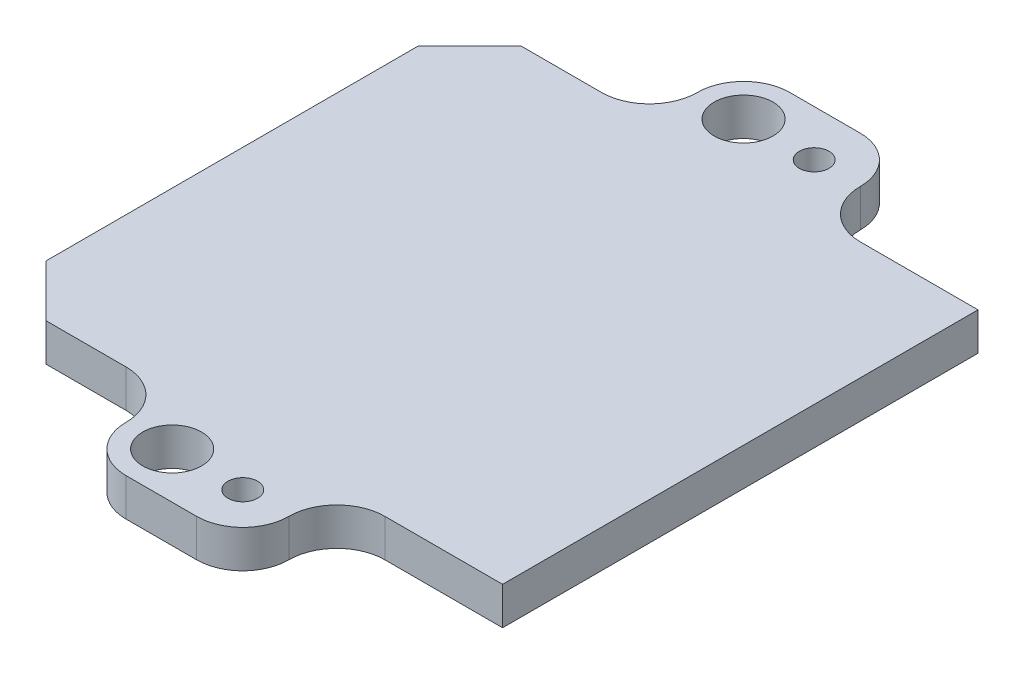
ISO-10303-21;
HEADER;
FILE_DESCRIPTION(('STEP AP214'),'2;1');
FILE_NAME('part.step','',(''),(''),'','','');
FILE_SCHEMA(('AUTOMOTIVE_DESIGN { 1 0 10303 214 1 1 1 1 }'));
ENDSEC;
DATA;
#1=APPLICATION_CONTEXT('core data for automotive mechanical design processes');
#2=APPLICATION_PROTOCOL_DEFINITION('international standard','automotive_design',2000,#1);
#3=PRODUCT_CONTEXT('',#1,'mechanical');
#4=PRODUCT('Part','Part','',(#3));
#5=PRODUCT_RELATED_PRODUCT_CATEGORY('part','',(#4));
#6=PRODUCT_DEFINITION_FORMATION('','',#4);
#7=PRODUCT_DEFINITION_CONTEXT('part definition',#1,'design');
#8=PRODUCT_DEFINITION('design','',#6,#7);
#9=PRODUCT_DEFINITION_SHAPE('','',#8);
#10=(LENGTH_UNIT() NAMED_UNIT(*) SI_UNIT(.MILLI.,.METRE.));
#11=(NAMED_UNIT(*) PLANE_ANGLE_UNIT() SI_UNIT($,.RADIAN.));
#12=(NAMED_UNIT(*) SI_UNIT($,.STERADIAN.) SOLID_ANGLE_UNIT());
#13=UNCERTAINTY_MEASURE_WITH_UNIT(LENGTH_MEASURE(1.E-05),#10,'distance_accuracy_value','');
#14=(GEOMETRIC_REPRESENTATION_CONTEXT(3) GLOBAL_UNCERTAINTY_ASSIGNED_CONTEXT((#13)) GLOBAL_UNIT_ASSIGNED_CONTEXT((#10,
#11,#12)) REPRESENTATION_CONTEXT('',''));
#15=CARTESIAN_POINT('',(0.,0.,0.));
#16=DIRECTION('',(0.,0.,1.));
#17=DIRECTION('',(1.,0.,0.));
#18=AXIS2_PLACEMENT_3D('',#15,#16,#17);
#19=CARTESIAN_POINT('',(4.77519999999999,2.032,-15.4178));
#20=DIRECTION('',(0.,1.,0.));
#21=DIRECTION('',(0.,0.,1.));
#22=AXIS2_PLACEMENT_3D('',#19,#20,#21);
#23=PLANE('',#22);
#24=DIRECTION('',(-1.,0.,0.));
#25=VECTOR('',#24,1.);
#26=CARTESIAN_POINT('',(-10.922,2.032,-12.827));
#27=LINE('',#26,#25);
#28=CARTESIAN_POINT('',(13.716,2.032,-12.827));
#29=VERTEX_POINT('',#28);
#30=CARTESIAN_POINT('',(7.36599999999999,2.032,-12.827));
#31=VERTEX_POINT('',#30);
#32=EDGE_CURVE('E52',#29,#31,#27,.T.);
#33=ORIENTED_EDGE('',*,*,#32,.T.);
#34=CARTESIAN_POINT('',(7.366,2.032,-15.4178));
#35=DIRECTION('',(0.,-1.,0.));
#36=DIRECTION('',(0.,0.,-1.));
#37=AXIS2_PLACEMENT_3D('',#34,#35,#36);
#38=CIRCLE('',#37,2.5908);
#39=CARTESIAN_POINT('',(4.77519999999999,2.032,-15.4178));
#40=VERTEX_POINT('',#39);
#41=EDGE_CURVE('E44',#31,#40,#38,.T.);
#42=ORIENTED_EDGE('',*,*,#41,.T.);
#43=CARTESIAN_POINT('',(2.28599999999999,2.032,-15.4178));
#44=DIRECTION('',(0.,-1.,0.));
#45=DIRECTION('',(0.,0.,-1.));
#46=AXIS2_PLACEMENT_3D('',#43,#44,#45);
#47=CIRCLE('',#46,2.4892);
#48=CARTESIAN_POINT('',(2.28599999999999,2.032,-17.907));
#49=VERTEX_POINT('',#48);
#50=EDGE_CURVE('E279',#40,#49,#47,.F.);
#51=ORIENTED_EDGE('',*,*,#50,.T.);
#52=DIRECTION('',(1.,0.,0.));
#53=VECTOR('',#52,1.);
#54=CARTESIAN_POINT('',(-13.717,2.032,-17.907));
#55=LINE('',#54,#53);
#56=CARTESIAN_POINT('',(-1.52400000000001,2.032,-17.907));
#57=VERTEX_POINT('',#56);
#58=EDGE_CURVE('E282',#57,#49,#55,.T.);
#59=ORIENTED_EDGE('',*,*,#58,.F.);
#60=CARTESIAN_POINT('',(-1.52400000000001,2.032,-15.4178));
#61=DIRECTION('',(0.,-1.,0.));
#62=DIRECTION('',(0.,0.,-1.));
#63=AXIS2_PLACEMENT_3D('',#60,#61,#62);
#64=CIRCLE('',#63,2.4892);
#65=CARTESIAN_POINT('',(-4.01320000000001,2.032,-15.4178));
#66=VERTEX_POINT('',#65);
#67=EDGE_CURVE('E58',#57,#66,#64,.F.);
#68=ORIENTED_EDGE('',*,*,#67,.T.);
#69=CARTESIAN_POINT('',(-6.60400000000001,2.032,-15.4178));
#70=DIRECTION('',(0.,-1.,0.));
#71=DIRECTION('',(0.,0.,-1.));
#72=AXIS2_PLACEMENT_3D('',#69,#70,#71);
#73=CIRCLE('',#72,2.5908);
#74=CARTESIAN_POINT('',(-6.60400000000001,2.032,-12.827));
#75=VERTEX_POINT('',#74);
#76=EDGE_CURVE('E11',#66,#75,#73,.T.);
#77=ORIENTED_EDGE('',*,*,#76,.T.);
#78=CARTESIAN_POINT('',(-10.922,2.032,-12.827));
#79=VERTEX_POINT('',#78);
#80=EDGE_CURVE('E293',#75,#79,#27,.T.);
#81=ORIENTED_EDGE('',*,*,#80,.T.);
#82=DIRECTION('',(-0.707106781186551,0.,0.707106781186544));
#83=VECTOR('',#82,1.);
#84=CARTESIAN_POINT('',(-10.922,2.032,-12.827));
#85=LINE('',#84,#83);
#86=CARTESIAN_POINT('',(-13.716,2.032,-10.033));
#87=VERTEX_POINT('',#86);
#88=EDGE_CURVE('E296',#79,#87,#85,.T.);
#89=ORIENTED_EDGE('',*,*,#88,.T.);
#90=DIRECTION('',(0.,0.,1.));
#91=VECTOR('',#90,1.);
#92=CARTESIAN_POINT('',(-13.716,2.032,-10.033));
#93=LINE('',#92,#91);
#94=CARTESIAN_POINT('',(-13.716,2.032,10.033));
#95=VERTEX_POINT('',#94);
#96=EDGE_CURVE('E187',#87,#95,#93,.T.);
#97=ORIENTED_EDGE('',*,*,#96,.T.);
#98=DIRECTION('',(0.707106781186546,0.,0.707106781186549));
#99=VECTOR('',#98,1.);
#100=CARTESIAN_POINT('',(-13.716,2.032,10.033));
#101=LINE('',#100,#99);
#102=CARTESIAN_POINT('',(-10.922,2.032,12.827));
#103=VERTEX_POINT('',#102);
#104=EDGE_CURVE('E184',#95,#103,#101,.T.);
#105=ORIENTED_EDGE('',*,*,#104,.T.);
#106=DIRECTION('',(1.,0.,0.));
#107=VECTOR('',#106,1.);
#108=CARTESIAN_POINT('',(-10.922,2.032,12.827));
#109=LINE('',#108,#107);
#110=CARTESIAN_POINT('',(-6.60400000000001,2.032,12.827));
#111=VERTEX_POINT('',#110);
#112=EDGE_CURVE('E165',#103,#111,#109,.T.);
#113=ORIENTED_EDGE('',*,*,#112,.T.);
#114=CARTESIAN_POINT('',(-6.60400000000001,2.032,15.4178));
#115=DIRECTION('',(0.,-1.,0.));
#116=DIRECTION('',(0.,0.,-1.));
#117=AXIS2_PLACEMENT_3D('',#114,#115,#116);
#118=CIRCLE('',#117,2.5908);
#119=CARTESIAN_POINT('',(-4.01320000000001,2.032,15.4178));
#120=VERTEX_POINT('',#119);
#121=EDGE_CURVE('E174',#111,#120,#118,.T.);
#122=ORIENTED_EDGE('',*,*,#121,.T.);
#123=CARTESIAN_POINT('',(-1.52400000000001,2.032,15.4178));
#124=DIRECTION('',(0.,-1.,0.));
#125=DIRECTION('',(0.,0.,-1.));
#126=AXIS2_PLACEMENT_3D('',#123,#124,#125);
#127=CIRCLE('',#126,2.4892);
#128=CARTESIAN_POINT('',(-1.52400000000001,2.032,17.907));
#129=VERTEX_POINT('',#128);
#130=EDGE_CURVE('E177',#120,#129,#127,.F.);
#131=ORIENTED_EDGE('',*,*,#130,.T.);
#132=DIRECTION('',(1.,0.,0.));
#133=VECTOR('',#132,1.);
#134=CARTESIAN_POINT('',(-13.717,2.032,17.907));
#135=LINE('',#134,#133);
#136=CARTESIAN_POINT('',(2.28599999999999,2.032,17.907));
#137=VERTEX_POINT('',#136);
#138=EDGE_CURVE('E178',#129,#137,#135,.T.);
#139=ORIENTED_EDGE('',*,*,#138,.T.);
#140=CARTESIAN_POINT('',(2.28599999999999,2.032,15.4178));
#141=DIRECTION('',(0.,-1.,0.));
#142=DIRECTION('',(0.,0.,-1.));
#143=AXIS2_PLACEMENT_3D('',#140,#141,#142);
#144=CIRCLE('',#143,2.4892);
#145=CARTESIAN_POINT('',(4.77519999999999,2.032,15.4178));
#146=VERTEX_POINT('',#145);
#147=EDGE_CURVE('E268',#137,#146,#144,.F.);
#148=ORIENTED_EDGE('',*,*,#147,.T.);
#149=CARTESIAN_POINT('',(7.36599999999999,2.032,15.4178));
#150=DIRECTION('',(0.,-1.,0.));
#151=DIRECTION('',(0.,0.,-1.));
#152=AXIS2_PLACEMENT_3D('',#149,#150,#151);
#153=CIRCLE('',#152,2.5908);
#154=CARTESIAN_POINT('',(7.36599999999999,2.032,12.827));
#155=VERTEX_POINT('',#154);
#156=EDGE_CURVE('E270',#146,#155,#153,.T.);
#157=ORIENTED_EDGE('',*,*,#156,.T.);
#158=CARTESIAN_POINT('',(13.716,2.032,12.827));
#159=VERTEX_POINT('',#158);
#160=EDGE_CURVE('E185',#155,#159,#109,.T.);
#161=ORIENTED_EDGE('',*,*,#160,.T.);
#162=DIRECTION('',(0.,0.,-1.));
#163=VECTOR('',#162,1.);
#164=CARTESIAN_POINT('',(13.716,2.032,-12.827));
#165=LINE('',#164,#163);
#166=EDGE_CURVE('E195',#159,#29,#165,.T.);
#167=ORIENTED_EDGE('',*,*,#166,.T.);
#168=EDGE_LOOP('',(#33,#42,#51,#59,#68,#77,#81,#89,#97,#105,#113,#122,#131,#139,#148,#157,#161,#167));
#169=FACE_BOUND('',#168,.T.);
#170=CARTESIAN_POINT('',(-1.52400000000001,2.032,-15.4178));
#171=DIRECTION('',(0.,-1.,0.));
#172=DIRECTION('',(0.,0.,-1.));
#173=AXIS2_PLACEMENT_3D('',#170,#171,#172);
#174=CIRCLE('',#173,1.5875);
#175=CARTESIAN_POINT('',(-1.52400000000001,2.032,-17.0053));
#176=VERTEX_POINT('',#175);
#177=EDGE_CURVE('E283',#176,#176,#174,.F.);
#178=ORIENTED_EDGE('',*,*,#177,.F.);
#179=EDGE_LOOP('',(#178));
#180=FACE_BOUND('',#179,.T.);
#181=CARTESIAN_POINT('',(2.28599999999999,2.032,-15.4178));
#182=DIRECTION('',(0.,-1.,0.));
#183=DIRECTION('',(0.,0.,-1.));
#184=AXIS2_PLACEMENT_3D('',#181,#182,#183);
#185=CIRCLE('',#184,0.8001);
#186=CARTESIAN_POINT('',(2.28599999999999,2.032,-16.2179));
#187=VERTEX_POINT('',#186);
#188=EDGE_CURVE('E286',#187,#187,#185,.F.);
#189=ORIENTED_EDGE('',*,*,#188,.F.);
#190=EDGE_LOOP('',(#189));
#191=FACE_BOUND('',#190,.T.);
#192=CARTESIAN_POINT('',(-1.52400000000001,2.032,15.4178));
#193=DIRECTION('',(0.,-1.,0.));
#194=DIRECTION('',(0.,0.,-1.));
#195=AXIS2_PLACEMENT_3D('',#192,#193,#194);
#196=CIRCLE('',#195,1.5875);
#197=CARTESIAN_POINT('',(-1.52400000000001,2.032,13.8303));
#198=VERTEX_POINT('',#197);
#199=EDGE_CURVE('E273',#198,#198,#196,.F.);
#200=ORIENTED_EDGE('',*,*,#199,.F.);
#201=EDGE_LOOP('',(#200));
#202=FACE_BOUND('',#201,.T.);
#203=CARTESIAN_POINT('',(2.28599999999999,2.032,15.4178));
#204=DIRECTION('',(0.,-1.,0.));
#205=DIRECTION('',(0.,0.,-1.));
#206=AXIS2_PLACEMENT_3D('',#203,#204,#205);
#207=CIRCLE('',#206,0.800099999999997);
#208=CARTESIAN_POINT('',(2.28599999999999,2.032,14.6177));
#209=VERTEX_POINT('',#208);
#210=EDGE_CURVE('E276',#209,#209,#207,.F.);
#211=ORIENTED_EDGE('',*,*,#210,.F.);
#212=EDGE_LOOP('',(#211));
#213=FACE_BOUND('',#212,.T.);
#214=ADVANCED_FACE('F35',(#169,#180,#191,#202,#213),#23,.T.);
#215=CARTESIAN_POINT('',(-10.922,8.89,-12.827));
#216=DIRECTION('',(0.707106781186544,0.,0.707106781186551));
#217=DIRECTION('',(0.707106781186551,0.,-0.707106781186544));
#218=AXIS2_PLACEMENT_3D('',#215,#216,#217);
#219=PLANE('',#218);
#220=ORIENTED_EDGE('',*,*,#88,.F.);
#221=DIRECTION('',(0.,-1.,0.));
#222=VECTOR('',#221,1.);
#223=CARTESIAN_POINT('',(-10.922,8.89,-12.827));
#224=LINE('',#223,#222);
#225=CARTESIAN_POINT('',(-10.922,0.,-12.827));
#226=VERTEX_POINT('',#225);
#227=EDGE_CURVE('E198',#79,#226,#224,.T.);
#228=ORIENTED_EDGE('',*,*,#227,.T.);
#229=DIRECTION('',(-0.707106781186551,0.,0.707106781186544));
#230=VECTOR('',#229,1.);
#231=CARTESIAN_POINT('',(-10.922,0.,-12.827));
#232=LINE('',#231,#230);
#233=CARTESIAN_POINT('',(-13.716,0.,-10.033));
#234=VERTEX_POINT('',#233);
#235=EDGE_CURVE('E224',#226,#234,#232,.T.);
#236=ORIENTED_EDGE('',*,*,#235,.T.);
#237=DIRECTION('',(0.,-1.,0.));
#238=VECTOR('',#237,1.);
#239=CARTESIAN_POINT('',(-13.716,8.89,-10.033));
#240=LINE('',#239,#238);
#241=EDGE_CURVE('E200',#87,#234,#240,.T.);
#242=ORIENTED_EDGE('',*,*,#241,.F.);
#243=EDGE_LOOP('',(#220,#228,#236,#242));
#244=FACE_BOUND('',#243,.T.);
#245=ADVANCED_FACE('F306',(#244),#219,.F.);
#246=CARTESIAN_POINT('',(-13.716,8.89,-10.033));
#247=DIRECTION('',(1.,0.,0.));
#248=DIRECTION('',(0.,0.,-1.));
#249=AXIS2_PLACEMENT_3D('',#246,#247,#248);
#250=PLANE('',#249);
#251=ORIENTED_EDGE('',*,*,#96,.F.);
#252=ORIENTED_EDGE('',*,*,#241,.T.);
#253=DIRECTION('',(0.,0.,1.));
#254=VECTOR('',#253,1.);
#255=CARTESIAN_POINT('',(-13.716,0.,-10.033));
#256=LINE('',#255,#254);
#257=CARTESIAN_POINT('',(-13.716,0.,10.033));
#258=VERTEX_POINT('',#257);
#259=EDGE_CURVE('E211',#234,#258,#256,.T.);
#260=ORIENTED_EDGE('',*,*,#259,.T.);
#261=DIRECTION('',(0.,-1.,0.));
#262=VECTOR('',#261,1.);
#263=CARTESIAN_POINT('',(-13.716,8.89,10.033));
#264=LINE('',#263,#262);
#265=EDGE_CURVE('E202',#95,#258,#264,.T.);
#266=ORIENTED_EDGE('',*,*,#265,.F.);
#267=EDGE_LOOP('',(#251,#252,#260,#266));
#268=FACE_BOUND('',#267,.T.);
#269=ADVANCED_FACE('F301',(#268),#250,.F.);
#270=CARTESIAN_POINT('',(-13.716,8.89,10.033));
#271=DIRECTION('',(0.707106781186549,0.,-0.707106781186546));
#272=DIRECTION('',(-0.707106781186546,0.,-0.707106781186549));
#273=AXIS2_PLACEMENT_3D('',#270,#271,#272);
#274=PLANE('',#273);
#275=ORIENTED_EDGE('',*,*,#104,.F.);
#276=ORIENTED_EDGE('',*,*,#265,.T.);
#277=DIRECTION('',(0.707106781186546,0.,0.707106781186549));
#278=VECTOR('',#277,1.);
#279=CARTESIAN_POINT('',(-13.716,0.,10.033));
#280=LINE('',#279,#278);
#281=CARTESIAN_POINT('',(-10.922,0.,12.827));
#282=VERTEX_POINT('',#281);
#283=EDGE_CURVE('E207',#258,#282,#280,.T.);
#284=ORIENTED_EDGE('',*,*,#283,.T.);
#285=DIRECTION('',(0.,-1.,0.));
#286=VECTOR('',#285,1.);
#287=CARTESIAN_POINT('',(-10.922,8.89,12.827));
#288=LINE('',#287,#286);
#289=EDGE_CURVE('E39',#103,#282,#288,.T.);
#290=ORIENTED_EDGE('',*,*,#289,.F.);
#291=EDGE_LOOP('',(#275,#276,#284,#290));
#292=FACE_BOUND('',#291,.T.);
#293=ADVANCED_FACE('F208',(#292),#274,.F.);
#294=CARTESIAN_POINT('',(13.716,8.89,-12.827));
#295=DIRECTION('',(-1.,0.,0.));
#296=DIRECTION('',(0.,0.,1.));
#297=AXIS2_PLACEMENT_3D('',#294,#295,#296);
#298=PLANE('',#297);
#299=ORIENTED_EDGE('',*,*,#166,.F.);
#300=DIRECTION('',(0.,-1.,0.));
#301=VECTOR('',#300,1.);
#302=CARTESIAN_POINT('',(13.716,8.89,12.827));
#303=LINE('',#302,#301);
#304=CARTESIAN_POINT('',(13.716,0.,12.827));
#305=VERTEX_POINT('',#304);
#306=EDGE_CURVE('E192',#159,#305,#303,.T.);
#307=ORIENTED_EDGE('',*,*,#306,.T.);
#308=DIRECTION('',(0.,0.,-1.));
#309=VECTOR('',#308,1.);
#310=CARTESIAN_POINT('',(13.716,0.,-12.827));
#311=LINE('',#310,#309);
#312=CARTESIAN_POINT('',(13.716,0.,-12.827));
#313=VERTEX_POINT('',#312);
#314=EDGE_CURVE('E248',#305,#313,#311,.T.);
#315=ORIENTED_EDGE('',*,*,#314,.T.);
#316=DIRECTION('',(0.,-1.,0.));
#317=VECTOR('',#316,1.);
#318=CARTESIAN_POINT('',(13.716,8.89,-12.827));
#319=LINE('',#318,#317);
#320=EDGE_CURVE('E194',#29,#313,#319,.T.);
#321=ORIENTED_EDGE('',*,*,#320,.F.);
#322=EDGE_LOOP('',(#299,#307,#315,#321));
#323=FACE_BOUND('',#322,.T.);
#324=ADVANCED_FACE('F344',(#323),#298,.F.);
#325=CARTESIAN_POINT('',(-10.922,8.89,12.827));
#326=DIRECTION('',(0.,0.,-1.));
#327=DIRECTION('',(-1.,0.,0.));
#328=AXIS2_PLACEMENT_3D('',#325,#326,#327);
#329=PLANE('',#328);
#330=ORIENTED_EDGE('',*,*,#112,.F.);
#331=ORIENTED_EDGE('',*,*,#289,.T.);
#332=DIRECTION('',(1.,0.,0.));
#333=VECTOR('',#332,1.);
#334=CARTESIAN_POINT('',(-10.922,0.,12.827));
#335=LINE('',#334,#333);
#336=CARTESIAN_POINT('',(-6.60400000000001,0.,12.827));
#337=VERTEX_POINT('',#336);
#338=EDGE_CURVE('E167',#282,#337,#335,.T.);
#339=ORIENTED_EDGE('',*,*,#338,.T.);
#340=DIRECTION('',(0.,-1.,0.));
#341=VECTOR('',#340,1.);
#342=CARTESIAN_POINT('',(-6.60400000000001,8.89,12.827));
#343=LINE('',#342,#341);
#344=EDGE_CURVE('E162',#111,#337,#343,.T.);
#345=ORIENTED_EDGE('',*,*,#344,.F.);
#346=EDGE_LOOP('',(#330,#331,#339,#345));
#347=FACE_BOUND('',#346,.T.);
#348=ADVANCED_FACE('F37',(#347),#329,.F.);
#349=CARTESIAN_POINT('',(-6.60400000000001,8.89,15.4178));
#350=DIRECTION('',(0.,-1.,0.));
#351=DIRECTION('',(0.,0.,-1.));
#352=AXIS2_PLACEMENT_3D('',#349,#350,#351);
#353=CYLINDRICAL_SURFACE('',#352,2.5908);
#354=DIRECTION('',(0.,-1.,0.));
#355=VECTOR('',#354,1.);
#356=CARTESIAN_POINT('',(-4.01320000000001,8.89,15.4178));
#357=LINE('',#356,#355);
#358=CARTESIAN_POINT('',(-4.01320000000001,0.,15.4178));
#359=VERTEX_POINT('',#358);
#360=EDGE_CURVE('E171',#120,#359,#357,.T.);
#361=ORIENTED_EDGE('',*,*,#360,.F.);
#362=ORIENTED_EDGE('',*,*,#121,.F.);
#363=ORIENTED_EDGE('',*,*,#344,.T.);
#364=CARTESIAN_POINT('',(-6.60400000000001,0.,15.4178));
#365=DIRECTION('',(0.,-1.,0.));
#366=DIRECTION('',(0.,0.,1.));
#367=AXIS2_PLACEMENT_3D('',#364,#365,#366);
#368=CIRCLE('',#367,2.5908);
#369=EDGE_CURVE('E217',#337,#359,#368,.T.);
#370=ORIENTED_EDGE('',*,*,#369,.T.);
#371=EDGE_LOOP('',(#361,#362,#363,#370));
#372=FACE_BOUND('',#371,.T.);
#373=ADVANCED_FACE('F175',(#372),#353,.F.);
#374=CARTESIAN_POINT('',(-1.52400000000001,8.89,15.4178));
#375=DIRECTION('',(0.,-1.,0.));
#376=DIRECTION('',(0.,0.,-1.));
#377=AXIS2_PLACEMENT_3D('',#374,#375,#376);
#378=CYLINDRICAL_SURFACE('',#377,2.4892);
#379=DIRECTION('',(0.,-1.,0.));
#380=VECTOR('',#379,1.);
#381=CARTESIAN_POINT('',(-1.52400000000001,8.89,17.907));
#382=LINE('',#381,#380);
#383=CARTESIAN_POINT('',(-1.52400000000001,0.,17.907));
#384=VERTEX_POINT('',#383);
#385=EDGE_CURVE('E372',#129,#384,#382,.T.);
#386=ORIENTED_EDGE('',*,*,#385,.F.);
#387=ORIENTED_EDGE('',*,*,#130,.F.);
#388=ORIENTED_EDGE('',*,*,#360,.T.);
#389=CARTESIAN_POINT('',(-1.52400000000001,0.,15.4178));
#390=DIRECTION('',(0.,1.,0.));
#391=DIRECTION('',(0.,0.,-1.));
#392=AXIS2_PLACEMENT_3D('',#389,#390,#391);
#393=CIRCLE('',#392,2.4892);
#394=EDGE_CURVE('E219',#359,#384,#393,.T.);
#395=ORIENTED_EDGE('',*,*,#394,.T.);
#396=EDGE_LOOP('',(#386,#387,#388,#395));
#397=FACE_BOUND('',#396,.T.);
#398=ADVANCED_FACE('F371',(#397),#378,.T.);
#399=CARTESIAN_POINT('',(-1.52400000000001,8.89,17.907));
#400=DIRECTION('',(0.,0.,-1.));
#401=DIRECTION('',(-1.,0.,0.));
#402=AXIS2_PLACEMENT_3D('',#399,#400,#401);
#403=PLANE('',#402);
#404=DIRECTION('',(0.,-1.,0.));
#405=VECTOR('',#404,1.);
#406=CARTESIAN_POINT('',(2.28599999999999,8.89,17.907));
#407=LINE('',#406,#405);
#408=CARTESIAN_POINT('',(2.28599999999999,0.,17.907));
#409=VERTEX_POINT('',#408);
#410=EDGE_CURVE('E377',#137,#409,#407,.T.);
#411=ORIENTED_EDGE('',*,*,#410,.F.);
#412=ORIENTED_EDGE('',*,*,#138,.F.);
#413=ORIENTED_EDGE('',*,*,#385,.T.);
#414=DIRECTION('',(1.,0.,0.));
#415=VECTOR('',#414,1.);
#416=CARTESIAN_POINT('',(-1.52400000000001,0.,17.907));
#417=LINE('',#416,#415);
#418=EDGE_CURVE('E362',#384,#409,#417,.T.);
#419=ORIENTED_EDGE('',*,*,#418,.T.);
#420=EDGE_LOOP('',(#411,#412,#413,#419));
#421=FACE_BOUND('',#420,.T.);
#422=ADVANCED_FACE('F375',(#421),#403,.F.);
#423=CARTESIAN_POINT('',(-10.922,8.89,-12.827));
#424=DIRECTION('',(0.,0.,1.));
#425=DIRECTION('',(1.,0.,0.));
#426=AXIS2_PLACEMENT_3D('',#423,#424,#425);
#427=PLANE('',#426);
#428=ORIENTED_EDGE('',*,*,#32,.F.);
#429=ORIENTED_EDGE('',*,*,#320,.T.);
#430=DIRECTION('',(-1.,0.,0.));
#431=VECTOR('',#430,1.);
#432=CARTESIAN_POINT('',(7.36599999999999,0.,-12.827));
#433=LINE('',#432,#431);
#434=CARTESIAN_POINT('',(7.36599999999999,0.,-12.827));
#435=VERTEX_POINT('',#434);
#436=EDGE_CURVE('E245',#313,#435,#433,.T.);
#437=ORIENTED_EDGE('',*,*,#436,.T.);
#438=DIRECTION('',(0.,-1.,0.));
#439=VECTOR('',#438,1.);
#440=CARTESIAN_POINT('',(7.36599999999999,8.89,-12.827));
#441=LINE('',#440,#439);
#442=EDGE_CURVE('E197',#31,#435,#441,.T.);
#443=ORIENTED_EDGE('',*,*,#442,.F.);
#444=EDGE_LOOP('',(#428,#429,#437,#443));
#445=FACE_BOUND('',#444,.T.);
#446=ADVANCED_FACE('F341',(#445),#427,.F.);
#447=CARTESIAN_POINT('',(7.366,8.89,-15.4178));
#448=DIRECTION('',(0.,-1.,0.));
#449=DIRECTION('',(0.,0.,-1.));
#450=AXIS2_PLACEMENT_3D('',#447,#448,#449);
#451=CYLINDRICAL_SURFACE('',#450,2.5908);
#452=DIRECTION('',(0.,-1.,0.));
#453=VECTOR('',#452,1.);
#454=CARTESIAN_POINT('',(4.77519999999999,8.89,-15.4178));
#455=LINE('',#454,#453);
#456=CARTESIAN_POINT('',(4.77519999999999,0.,-15.4178));
#457=VERTEX_POINT('',#456);
#458=EDGE_CURVE('E329',#40,#457,#455,.T.);
#459=ORIENTED_EDGE('',*,*,#458,.F.);
#460=ORIENTED_EDGE('',*,*,#41,.F.);
#461=ORIENTED_EDGE('',*,*,#442,.T.);
#462=CARTESIAN_POINT('',(7.366,0.,-15.4178));
#463=DIRECTION('',(0.,-1.,0.));
#464=DIRECTION('',(0.,0.,1.));
#465=AXIS2_PLACEMENT_3D('',#462,#463,#464);
#466=CIRCLE('',#465,2.5908);
#467=EDGE_CURVE('E242',#435,#457,#466,.T.);
#468=ORIENTED_EDGE('',*,*,#467,.T.);
#469=EDGE_LOOP('',(#459,#460,#461,#468));
#470=FACE_BOUND('',#469,.T.);
#471=ADVANCED_FACE('F337',(#470),#451,.F.);
#472=CARTESIAN_POINT('',(2.28599999999999,8.89,-15.4178));
#473=DIRECTION('',(0.,-1.,0.));
#474=DIRECTION('',(0.,0.,-1.));
#475=AXIS2_PLACEMENT_3D('',#472,#473,#474);
#476=CYLINDRICAL_SURFACE('',#475,2.4892);
#477=DIRECTION('',(0.,-1.,0.));
#478=VECTOR('',#477,1.);
#479=CARTESIAN_POINT('',(2.28599999999999,8.89,-17.907));
#480=LINE('',#479,#478);
#481=CARTESIAN_POINT('',(2.28599999999999,0.,-17.907));
#482=VERTEX_POINT('',#481);
#483=EDGE_CURVE('E323',#49,#482,#480,.T.);
#484=ORIENTED_EDGE('',*,*,#483,.F.);
#485=ORIENTED_EDGE('',*,*,#50,.F.);
#486=ORIENTED_EDGE('',*,*,#458,.T.);
#487=CARTESIAN_POINT('',(2.28599999999999,0.,-15.4178));
#488=DIRECTION('',(0.,1.,0.));
#489=DIRECTION('',(0.,0.,-1.));
#490=AXIS2_PLACEMENT_3D('',#487,#488,#489);
#491=CIRCLE('',#490,2.4892);
#492=EDGE_CURVE('E239',#457,#482,#491,.T.);
#493=ORIENTED_EDGE('',*,*,#492,.T.);
#494=EDGE_LOOP('',(#484,#485,#486,#493));
#495=FACE_BOUND('',#494,.T.);
#496=ADVANCED_FACE('F331',(#495),#476,.T.);
#497=CARTESIAN_POINT('',(-1.52400000000001,8.89,-17.907));
#498=DIRECTION('',(0.,0.,1.));
#499=DIRECTION('',(1.,0.,0.));
#500=AXIS2_PLACEMENT_3D('',#497,#498,#499);
#501=PLANE('',#500);
#502=DIRECTION('',(0.,-1.,0.));
#503=VECTOR('',#502,1.);
#504=CARTESIAN_POINT('',(-1.52400000000001,8.89,-17.907));
#505=LINE('',#504,#503);
#506=CARTESIAN_POINT('',(-1.52400000000001,0.,-17.907));
#507=VERTEX_POINT('',#506);
#508=EDGE_CURVE('E321',#57,#507,#505,.T.);
#509=ORIENTED_EDGE('',*,*,#508,.F.);
#510=ORIENTED_EDGE('',*,*,#58,.T.);
#511=ORIENTED_EDGE('',*,*,#483,.T.);
#512=DIRECTION('',(-1.,0.,0.));
#513=VECTOR('',#512,1.);
#514=CARTESIAN_POINT('',(-1.52400000000001,0.,-17.907));
#515=LINE('',#514,#513);
#516=EDGE_CURVE('E236',#482,#507,#515,.T.);
#517=ORIENTED_EDGE('',*,*,#516,.T.);
#518=EDGE_LOOP('',(#509,#510,#511,#517));
#519=FACE_BOUND('',#518,.T.);
#520=ADVANCED_FACE('F325',(#519),#501,.F.);
#521=CARTESIAN_POINT('',(7.366,0.,-15.4178));
#522=DIRECTION('',(0.,1.,0.));
#523=DIRECTION('',(0.,0.,1.));
#524=AXIS2_PLACEMENT_3D('',#521,#522,#523);
#525=PLANE('',#524);
#526=DIRECTION('',(1.,0.,0.));
#527=VECTOR('',#526,1.);
#528=CARTESIAN_POINT('',(7.36599999999999,0.,12.827));
#529=LINE('',#528,#527);
#530=CARTESIAN_POINT('',(7.36599999999998,0.,12.827));
#531=VERTEX_POINT('',#530);
#532=EDGE_CURVE('E251',#531,#305,#529,.T.);
#533=ORIENTED_EDGE('',*,*,#532,.F.);
#534=CARTESIAN_POINT('',(7.36599999999999,0.,15.4178));
#535=DIRECTION('',(0.,-1.,0.));
#536=DIRECTION('',(0.,0.,-1.));
#537=AXIS2_PLACEMENT_3D('',#534,#535,#536);
#538=CIRCLE('',#537,2.5908);
#539=CARTESIAN_POINT('',(4.77519999999999,0.,15.4178));
#540=VERTEX_POINT('',#539);
#541=EDGE_CURVE('E353',#540,#531,#538,.T.);
#542=ORIENTED_EDGE('',*,*,#541,.F.);
#543=CARTESIAN_POINT('',(2.28599999999999,0.,15.4178));
#544=DIRECTION('',(0.,1.,0.));
#545=DIRECTION('',(0.,0.,1.));
#546=AXIS2_PLACEMENT_3D('',#543,#544,#545);
#547=CIRCLE('',#546,2.4892);
#548=EDGE_CURVE('E360',#409,#540,#547,.T.);
#549=ORIENTED_EDGE('',*,*,#548,.F.);
#550=ORIENTED_EDGE('',*,*,#418,.F.);
#551=ORIENTED_EDGE('',*,*,#394,.F.);
#552=ORIENTED_EDGE('',*,*,#369,.F.);
#553=ORIENTED_EDGE('',*,*,#338,.F.);
#554=ORIENTED_EDGE('',*,*,#283,.F.);
#555=ORIENTED_EDGE('',*,*,#259,.F.);
#556=ORIENTED_EDGE('',*,*,#235,.F.);
#557=DIRECTION('',(-1.,0.,0.));
#558=VECTOR('',#557,1.);
#559=CARTESIAN_POINT('',(-10.922,0.,-12.827));
#560=LINE('',#559,#558);
#561=CARTESIAN_POINT('',(-6.60400000000001,0.,-12.827));
#562=VERTEX_POINT('',#561);
#563=EDGE_CURVE('E227',#562,#226,#560,.T.);
#564=ORIENTED_EDGE('',*,*,#563,.F.);
#565=CARTESIAN_POINT('',(-6.60400000000001,0.,-15.4178));
#566=DIRECTION('',(0.,-1.,0.));
#567=DIRECTION('',(0.,0.,-1.));
#568=AXIS2_PLACEMENT_3D('',#565,#566,#567);
#569=CIRCLE('',#568,2.5908);
#570=CARTESIAN_POINT('',(-4.01320000000001,0.,-15.4178));
#571=VERTEX_POINT('',#570);
#572=EDGE_CURVE('E230',#571,#562,#569,.T.);
#573=ORIENTED_EDGE('',*,*,#572,.F.);
#574=CARTESIAN_POINT('',(-1.52400000000001,0.,-15.4178));
#575=DIRECTION('',(0.,1.,0.));
#576=DIRECTION('',(0.,0.,1.));
#577=AXIS2_PLACEMENT_3D('',#574,#575,#576);
#578=CIRCLE('',#577,2.4892);
#579=EDGE_CURVE('E233',#507,#571,#578,.T.);
#580=ORIENTED_EDGE('',*,*,#579,.F.);
#581=ORIENTED_EDGE('',*,*,#516,.F.);
#582=ORIENTED_EDGE('',*,*,#492,.F.);
#583=ORIENTED_EDGE('',*,*,#467,.F.);
#584=ORIENTED_EDGE('',*,*,#436,.F.);
#585=ORIENTED_EDGE('',*,*,#314,.F.);
#586=EDGE_LOOP('',(#533,#542,#549,#550,#551,#552,#553,#554,#555,#556,#564,#573,#580,#581,#582,
#583,#584,#585));
#587=FACE_BOUND('',#586,.T.);
#588=CARTESIAN_POINT('',(-1.52400000000001,0.,-15.4178));
#589=DIRECTION('',(0.,1.,0.));
#590=DIRECTION('',(0.,0.,1.));
#591=AXIS2_PLACEMENT_3D('',#588,#589,#590);
#592=CIRCLE('',#591,1.5875);
#593=CARTESIAN_POINT('',(-1.52400000000001,0.,-13.8303));
#594=VERTEX_POINT('',#593);
#595=EDGE_CURVE('E254',#594,#594,#592,.T.);
#596=ORIENTED_EDGE('',*,*,#595,.T.);
#597=EDGE_LOOP('',(#596));
#598=FACE_BOUND('',#597,.T.);
#599=CARTESIAN_POINT('',(2.28599999999999,0.,-15.4178));
#600=DIRECTION('',(0.,1.,0.));
#601=DIRECTION('',(0.,0.,1.));
#602=AXIS2_PLACEMENT_3D('',#599,#600,#601);
#603=CIRCLE('',#602,0.8001);
#604=CARTESIAN_POINT('',(2.28599999999999,0.,-14.6177));
#605=VERTEX_POINT('',#604);
#606=EDGE_CURVE('E257',#605,#605,#603,.T.);
#607=ORIENTED_EDGE('',*,*,#606,.T.);
#608=EDGE_LOOP('',(#607));
#609=FACE_BOUND('',#608,.T.);
#610=CARTESIAN_POINT('',(-1.52400000000001,0.,15.4178));
#611=DIRECTION('',(0.,1.,0.));
#612=DIRECTION('',(0.,0.,-1.));
#613=AXIS2_PLACEMENT_3D('',#610,#611,#612);
#614=CIRCLE('',#613,1.5875);
#615=CARTESIAN_POINT('',(-1.52400000000001,0.,13.8303));
#616=VERTEX_POINT('',#615);
#617=EDGE_CURVE('E260',#616,#616,#614,.T.);
#618=ORIENTED_EDGE('',*,*,#617,.T.);
#619=EDGE_LOOP('',(#618));
#620=FACE_BOUND('',#619,.T.);
#621=CARTESIAN_POINT('',(2.28599999999999,0.,15.4178));
#622=DIRECTION('',(0.,1.,0.));
#623=DIRECTION('',(0.,0.,-1.));
#624=AXIS2_PLACEMENT_3D('',#621,#622,#623);
#625=CIRCLE('',#624,0.800099999999997);
#626=CARTESIAN_POINT('',(2.28599999999999,0.,14.6177));
#627=VERTEX_POINT('',#626);
#628=EDGE_CURVE('E263',#627,#627,#625,.T.);
#629=ORIENTED_EDGE('',*,*,#628,.T.);
#630=EDGE_LOOP('',(#629));
#631=FACE_BOUND('',#630,.T.);
#632=ADVANCED_FACE('F214',(#587,#598,#609,#620,#631),#525,.F.);
#633=CARTESIAN_POINT('',(-1.52400000000001,8.89,-15.4178));
#634=DIRECTION('',(0.,-1.,0.));
#635=DIRECTION('',(0.,0.,-1.));
#636=AXIS2_PLACEMENT_3D('',#633,#634,#635);
#637=CYLINDRICAL_SURFACE('',#636,2.4892);
#638=DIRECTION('',(0.,-1.,0.));
#639=VECTOR('',#638,1.);
#640=CARTESIAN_POINT('',(-4.01320000000001,8.89,-15.4178));
#641=LINE('',#640,#639);
#642=EDGE_CURVE('E311',#66,#571,#641,.T.);
#643=ORIENTED_EDGE('',*,*,#642,.F.);
#644=ORIENTED_EDGE('',*,*,#67,.F.);
#645=ORIENTED_EDGE('',*,*,#508,.T.);
#646=ORIENTED_EDGE('',*,*,#579,.T.);
#647=EDGE_LOOP('',(#643,#644,#645,#646));
#648=FACE_BOUND('',#647,.T.);
#649=ADVANCED_FACE('F319',(#648),#637,.T.);
#650=ORIENTED_EDGE('',*,*,#80,.F.);
#651=DIRECTION('',(0.,-1.,0.));
#652=VECTOR('',#651,1.);
#653=CARTESIAN_POINT('',(-6.60400000000001,8.89,-12.827));
#654=LINE('',#653,#652);
#655=EDGE_CURVE('E201',#75,#562,#654,.T.);
#656=ORIENTED_EDGE('',*,*,#655,.T.);
#657=ORIENTED_EDGE('',*,*,#563,.T.);
#658=ORIENTED_EDGE('',*,*,#227,.F.);
#659=EDGE_LOOP('',(#650,#656,#657,#658));
#660=FACE_BOUND('',#659,.T.);
#661=ADVANCED_FACE('F308',(#660),#427,.F.);
#662=CARTESIAN_POINT('',(-6.60400000000001,8.89,-15.4178));
#663=DIRECTION('',(0.,-1.,0.));
#664=DIRECTION('',(0.,0.,-1.));
#665=AXIS2_PLACEMENT_3D('',#662,#663,#664);
#666=CYLINDRICAL_SURFACE('',#665,2.5908);
#667=ORIENTED_EDGE('',*,*,#655,.F.);
#668=ORIENTED_EDGE('',*,*,#76,.F.);
#669=ORIENTED_EDGE('',*,*,#642,.T.);
#670=ORIENTED_EDGE('',*,*,#572,.T.);
#671=EDGE_LOOP('',(#667,#668,#669,#670));
#672=FACE_BOUND('',#671,.T.);
#673=ADVANCED_FACE('F313',(#672),#666,.F.);
#674=CARTESIAN_POINT('',(2.28599999999999,8.89,-15.4178));
#675=DIRECTION('',(0.,-1.,0.));
#676=DIRECTION('',(0.,0.,-1.));
#677=AXIS2_PLACEMENT_3D('',#674,#675,#676);
#678=CYLINDRICAL_SURFACE('',#677,0.8001);
#679=ORIENTED_EDGE('',*,*,#188,.T.);
#680=EDGE_LOOP('',(#679));
#681=FACE_BOUND('',#680,.T.);
#682=ORIENTED_EDGE('',*,*,#606,.F.);
#683=EDGE_LOOP('',(#682));
#684=FACE_BOUND('',#683,.T.);
#685=ADVANCED_FACE('F393',(#681,#684),#678,.F.);
#686=CARTESIAN_POINT('',(-1.52400000000001,8.89,-15.4178));
#687=DIRECTION('',(0.,-1.,0.));
#688=DIRECTION('',(0.,0.,-1.));
#689=AXIS2_PLACEMENT_3D('',#686,#687,#688);
#690=CYLINDRICAL_SURFACE('',#689,1.5875);
#691=ORIENTED_EDGE('',*,*,#177,.T.);
#692=EDGE_LOOP('',(#691));
#693=FACE_BOUND('',#692,.T.);
#694=ORIENTED_EDGE('',*,*,#595,.F.);
#695=EDGE_LOOP('',(#694));
#696=FACE_BOUND('',#695,.T.);
#697=ADVANCED_FACE('F387',(#693,#696),#690,.F.);
#698=CARTESIAN_POINT('',(2.28599999999999,8.89,15.4178));
#699=DIRECTION('',(0.,-1.,0.));
#700=DIRECTION('',(0.,0.,-1.));
#701=AXIS2_PLACEMENT_3D('',#698,#699,#700);
#702=CYLINDRICAL_SURFACE('',#701,2.4892);
#703=DIRECTION('',(0.,-1.,0.));
#704=VECTOR('',#703,1.);
#705=CARTESIAN_POINT('',(4.77519999999999,8.89,15.4178));
#706=LINE('',#705,#704);
#707=EDGE_CURVE('E354',#146,#540,#706,.T.);
#708=ORIENTED_EDGE('',*,*,#707,.F.);
#709=ORIENTED_EDGE('',*,*,#147,.F.);
#710=ORIENTED_EDGE('',*,*,#410,.T.);
#711=ORIENTED_EDGE('',*,*,#548,.T.);
#712=EDGE_LOOP('',(#708,#709,#710,#711));
#713=FACE_BOUND('',#712,.T.);
#714=ADVANCED_FACE('F385',(#713),#702,.T.);
#715=ORIENTED_EDGE('',*,*,#160,.F.);
#716=DIRECTION('',(0.,-1.,0.));
#717=VECTOR('',#716,1.);
#718=CARTESIAN_POINT('',(7.36599999999998,8.89,12.827));
#719=LINE('',#718,#717);
#720=EDGE_CURVE('E349',#155,#531,#719,.T.);
#721=ORIENTED_EDGE('',*,*,#720,.T.);
#722=ORIENTED_EDGE('',*,*,#532,.T.);
#723=ORIENTED_EDGE('',*,*,#306,.F.);
#724=EDGE_LOOP('',(#715,#721,#722,#723));
#725=FACE_BOUND('',#724,.T.);
#726=ADVANCED_FACE('F348',(#725),#329,.F.);
#727=CARTESIAN_POINT('',(7.36599999999999,8.89,15.4178));
#728=DIRECTION('',(0.,-1.,0.));
#729=DIRECTION('',(0.,0.,-1.));
#730=AXIS2_PLACEMENT_3D('',#727,#728,#729);
#731=CYLINDRICAL_SURFACE('',#730,2.5908);
#732=ORIENTED_EDGE('',*,*,#720,.F.);
#733=ORIENTED_EDGE('',*,*,#156,.F.);
#734=ORIENTED_EDGE('',*,*,#707,.T.);
#735=ORIENTED_EDGE('',*,*,#541,.T.);
#736=EDGE_LOOP('',(#732,#733,#734,#735));
#737=FACE_BOUND('',#736,.T.);
#738=ADVANCED_FACE('F356',(#737),#731,.F.);
#739=CARTESIAN_POINT('',(2.28599999999999,8.89,15.4178));
#740=DIRECTION('',(0.,-1.,0.));
#741=DIRECTION('',(0.,0.,-1.));
#742=AXIS2_PLACEMENT_3D('',#739,#740,#741);
#743=CYLINDRICAL_SURFACE('',#742,0.800099999999997);
#744=ORIENTED_EDGE('',*,*,#210,.T.);
#745=EDGE_LOOP('',(#744));
#746=FACE_BOUND('',#745,.T.);
#747=ORIENTED_EDGE('',*,*,#628,.F.);
#748=EDGE_LOOP('',(#747));
#749=FACE_BOUND('',#748,.T.);
#750=ADVANCED_FACE('F574',(#746,#749),#743,.F.);
#751=CARTESIAN_POINT('',(-1.52400000000001,8.89,15.4178));
#752=DIRECTION('',(0.,-1.,0.));
#753=DIRECTION('',(0.,0.,-1.));
#754=AXIS2_PLACEMENT_3D('',#751,#752,#753);
#755=CYLINDRICAL_SURFACE('',#754,1.5875);
#756=ORIENTED_EDGE('',*,*,#199,.T.);
#757=EDGE_LOOP('',(#756));
#758=FACE_BOUND('',#757,.T.);
#759=ORIENTED_EDGE('',*,*,#617,.F.);
#760=EDGE_LOOP('',(#759));
#761=FACE_BOUND('',#760,.T.);
#762=ADVANCED_FACE('F406',(#758,#761),#755,.F.);
#763=CLOSED_SHELL('',(#214,#245,#269,#293,#324,#348,#373,#398,#422,#446,#471,#496,#520,#632,
#649,#661,#673,#685,#697,#714,#726,#738,#750,#762));
#764=MANIFOLD_SOLID_BREP('B2',#763);
#765=ADVANCED_BREP_SHAPE_REPRESENTATION('',(#18,#764),#14);
#766=SHAPE_DEFINITION_REPRESENTATION(#9,#765);
ENDSEC;
END-ISO-10303-21;
